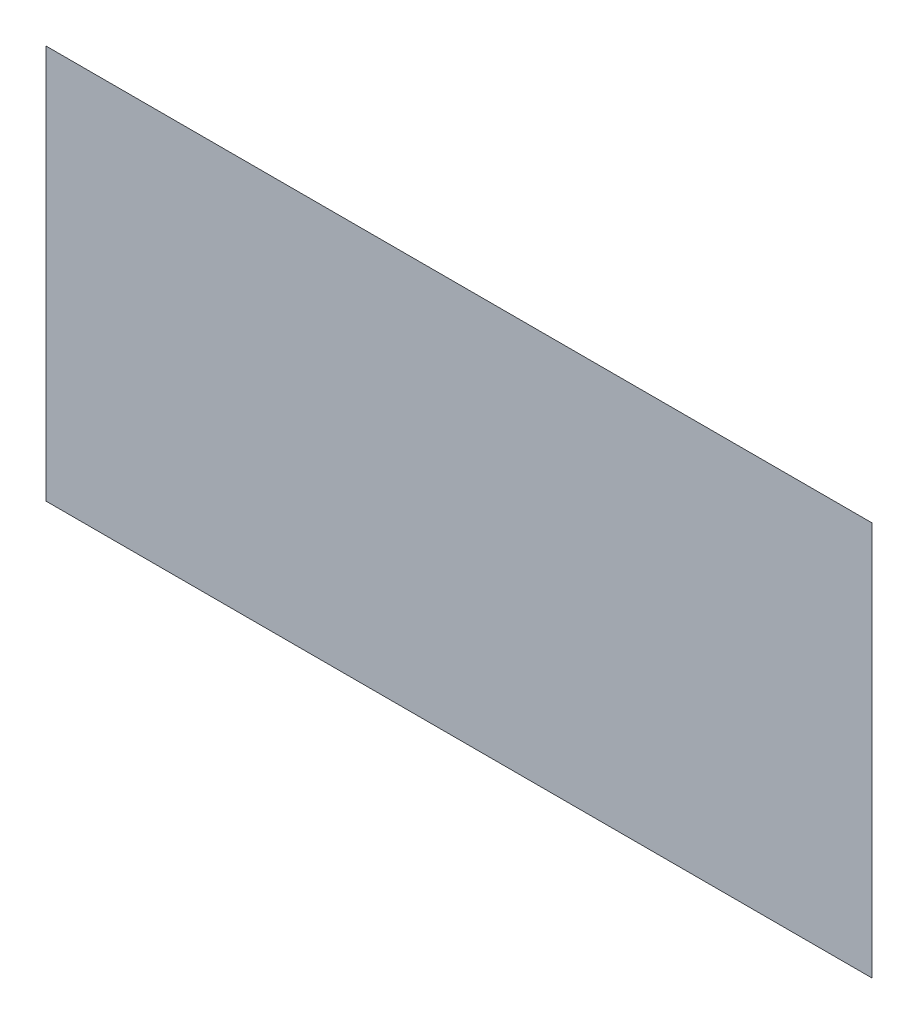
ISO-10303-21;
HEADER;
FILE_DESCRIPTION(('STEP AP214'),'2;1');
FILE_NAME('part.step','',(''),(''),'','','');
FILE_SCHEMA(('AUTOMOTIVE_DESIGN { 1 0 10303 214 1 1 1 1 }'));
ENDSEC;
DATA;
#1=APPLICATION_CONTEXT('core data for automotive mechanical design processes');
#2=APPLICATION_PROTOCOL_DEFINITION('international standard','automotive_design',2000,#1);
#3=PRODUCT_CONTEXT('',#1,'mechanical');
#4=PRODUCT('Part','Part','',(#3));
#5=PRODUCT_RELATED_PRODUCT_CATEGORY('part','',(#4));
#6=PRODUCT_DEFINITION_FORMATION('','',#4);
#7=PRODUCT_DEFINITION_CONTEXT('part definition',#1,'design');
#8=PRODUCT_DEFINITION('design','',#6,#7);
#9=PRODUCT_DEFINITION_SHAPE('','',#8);
#10=(LENGTH_UNIT() NAMED_UNIT(*) SI_UNIT(.MILLI.,.METRE.));
#11=(NAMED_UNIT(*) PLANE_ANGLE_UNIT() SI_UNIT($,.RADIAN.));
#12=(NAMED_UNIT(*) SI_UNIT($,.STERADIAN.) SOLID_ANGLE_UNIT());
#13=UNCERTAINTY_MEASURE_WITH_UNIT(LENGTH_MEASURE(1.E-05),#10,'distance_accuracy_value','');
#14=(GEOMETRIC_REPRESENTATION_CONTEXT(3) GLOBAL_UNCERTAINTY_ASSIGNED_CONTEXT((#13)) GLOBAL_UNIT_ASSIGNED_CONTEXT((#10,
#11,#12)) REPRESENTATION_CONTEXT('',''));
#15=CARTESIAN_POINT('',(0.,0.,0.));
#16=DIRECTION('',(0.,0.,1.));
#17=DIRECTION('',(1.,0.,0.));
#18=AXIS2_PLACEMENT_3D('',#15,#16,#17);
#19=CARTESIAN_POINT('',(2.566999893188,45.525,1.1596000001));
#20=DIRECTION('',(0.,0.,1.));
#21=DIRECTION('',(1.,0.,0.));
#22=AXIS2_PLACEMENT_3D('',#19,#20,#21);
#23=PLANE('',#22);
#24=CARTESIAN_POINT('',(1.466999969482,45.,1.1596000001));
#25=DIRECTION('',(1.,0.,0.));
#26=VECTOR('',#25,1.);
#27=LINE('',#24,#26);
#28=CARTESIAN_POINT('',(1.466999969482,45.,1.1595500001));
#29=VERTEX_POINT('',#28);
#30=CARTESIAN_POINT('',(3.666999816895,45.,1.1595500001));
#31=VERTEX_POINT('',#30);
#32=EDGE_CURVE('E53',#29,#31,#27,.T.);
#33=ORIENTED_EDGE('',*,*,#32,.T.);
#34=CARTESIAN_POINT('',(3.666999816895,45.,1.1596000001));
#35=DIRECTION('',(0.,1.,0.));
#36=VECTOR('',#35,1.);
#37=LINE('',#34,#36);
#38=CARTESIAN_POINT('',(3.666999816895,46.05,1.1595500001));
#39=VERTEX_POINT('',#38);
#40=EDGE_CURVE('E56',#31,#39,#37,.T.);
#41=ORIENTED_EDGE('',*,*,#40,.T.);
#42=CARTESIAN_POINT('',(3.666999816895,46.05,1.1596000001));
#43=DIRECTION('',(-1.,0.,0.));
#44=VECTOR('',#43,1.);
#45=LINE('',#42,#44);
#46=CARTESIAN_POINT('',(1.466999969482,46.05,1.1595500001));
#47=VERTEX_POINT('',#46);
#48=EDGE_CURVE('E11',#39,#47,#45,.T.);
#49=ORIENTED_EDGE('',*,*,#48,.T.);
#50=CARTESIAN_POINT('',(1.466999969482,46.05,1.1596000001));
#51=DIRECTION('',(0.,-1.,0.));
#52=VECTOR('',#51,1.);
#53=LINE('',#50,#52);
#54=EDGE_CURVE('E28',#47,#29,#53,.T.);
#55=ORIENTED_EDGE('',*,*,#54,.T.);
#56=EDGE_LOOP('',(#33,#41,#49,#55));
#57=FACE_BOUND('',#56,.T.);
#58=ADVANCED_FACE('F17',(#57),#23,.T.);
#59=CARTESIAN_POINT('',(2.566999893188,45.525,1.1595000001));
#60=DIRECTION('',(0.,0.,1.));
#61=DIRECTION('',(1.,0.,0.));
#62=AXIS2_PLACEMENT_3D('',#59,#60,#61);
#63=PLANE('',#62);
#64=ORIENTED_EDGE('',*,*,#40,.F.);
#65=ORIENTED_EDGE('',*,*,#32,.F.);
#66=ORIENTED_EDGE('',*,*,#54,.F.);
#67=ORIENTED_EDGE('',*,*,#48,.F.);
#68=EDGE_LOOP('',(#64,#65,#66,#67));
#69=FACE_BOUND('',#68,.T.);
#70=ADVANCED_FACE('F63',(#69),#63,.F.);
#71=CLOSED_SHELL('',(#58,#70));
#72=MANIFOLD_SOLID_BREP('B1',#71);
#73=ADVANCED_BREP_SHAPE_REPRESENTATION('',(#18,#72),#14);
#74=SHAPE_DEFINITION_REPRESENTATION(#9,#73);
ENDSEC;
END-ISO-10303-21;
